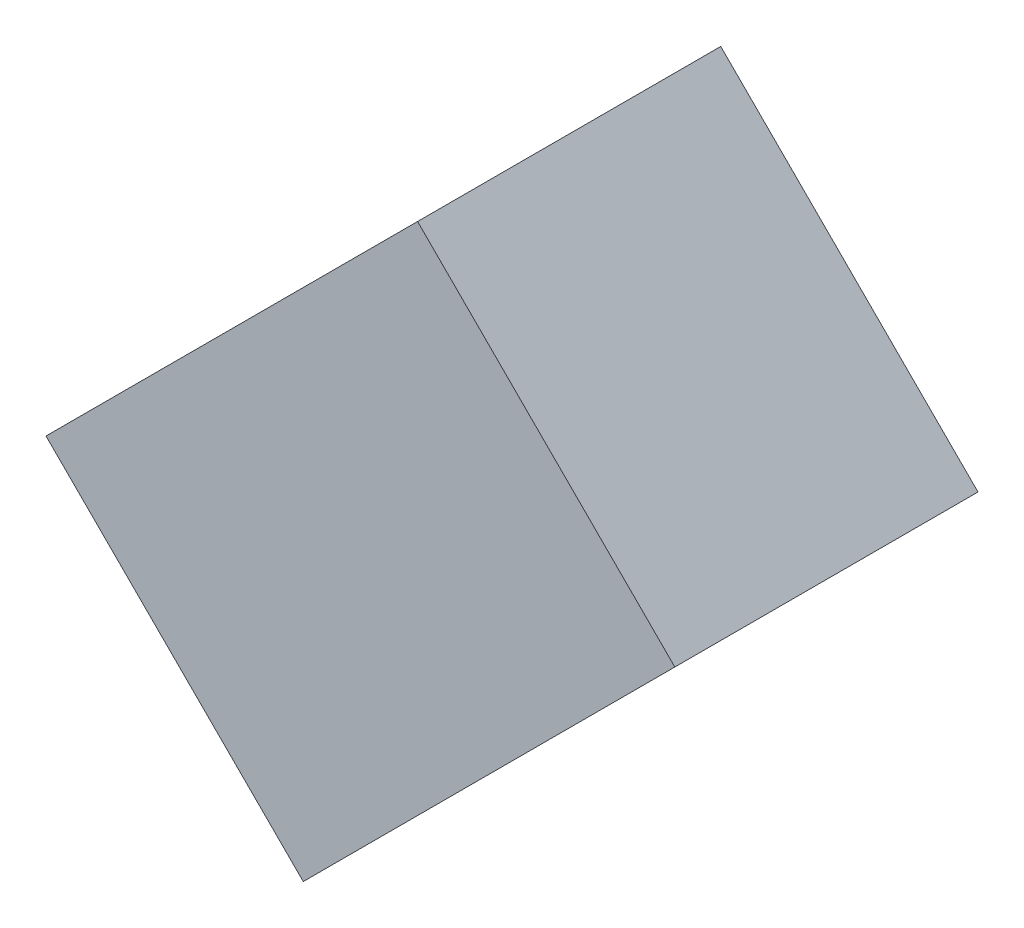
ISO-10303-21;
HEADER;
FILE_DESCRIPTION(('STEP AP214'),'2;1');
FILE_NAME('part.step','',(''),(''),'','','');
FILE_SCHEMA(('AUTOMOTIVE_DESIGN { 1 0 10303 214 1 1 1 1 }'));
ENDSEC;
DATA;
#1=APPLICATION_CONTEXT('core data for automotive mechanical design processes');
#2=APPLICATION_PROTOCOL_DEFINITION('international standard','automotive_design',2000,#1);
#3=PRODUCT_CONTEXT('',#1,'mechanical');
#4=PRODUCT('Part','Part','',(#3));
#5=PRODUCT_RELATED_PRODUCT_CATEGORY('part','',(#4));
#6=PRODUCT_DEFINITION_FORMATION('','',#4);
#7=PRODUCT_DEFINITION_CONTEXT('part definition',#1,'design');
#8=PRODUCT_DEFINITION('design','',#6,#7);
#9=PRODUCT_DEFINITION_SHAPE('','',#8);
#10=(LENGTH_UNIT() NAMED_UNIT(*) SI_UNIT(.MILLI.,.METRE.));
#11=(NAMED_UNIT(*) PLANE_ANGLE_UNIT() SI_UNIT($,.RADIAN.));
#12=(NAMED_UNIT(*) SI_UNIT($,.STERADIAN.) SOLID_ANGLE_UNIT());
#13=UNCERTAINTY_MEASURE_WITH_UNIT(LENGTH_MEASURE(1.E-05),#10,'distance_accuracy_value','');
#14=(GEOMETRIC_REPRESENTATION_CONTEXT(3) GLOBAL_UNCERTAINTY_ASSIGNED_CONTEXT((#13)) GLOBAL_UNIT_ASSIGNED_CONTEXT((#10,
#11,#12)) REPRESENTATION_CONTEXT('',''));
#15=CARTESIAN_POINT('',(0.,0.,0.));
#16=DIRECTION('',(0.,0.,1.));
#17=DIRECTION('',(1.,0.,0.));
#18=AXIS2_PLACEMENT_3D('',#15,#16,#17);
#19=CARTESIAN_POINT('',(-19.500015189612,-4.07757322966242,2.87531708400001));
#20=CARTESIAN_POINT('',(-19.500015189612,-4.07757322966242,1.97531583600001));
#21=CARTESIAN_POINT('',(-18.736341837612,-4.84124658166243,2.87531708400001));
#22=CARTESIAN_POINT('',(-18.736341837612,-4.84124658166243,1.97531583600001));
#23=(BOUNDED_SURFACE() B_SPLINE_SURFACE(1,1,((#19,#20),(#21,#22)),.UNSPECIFIED.,.F.,.F.,
.F.) B_SPLINE_SURFACE_WITH_KNOTS((2,2),(2,2),(-8.9999767635111E-05,0.000989997443986221),
(-0.000825001144,7.5000104E-05),
.UNSPECIFIED.) GEOMETRIC_REPRESENTATION_ITEM() RATIONAL_B_SPLINE_SURFACE(((1.,1.),(1.,1.))) REPRESENTATION_ITEM('') SURFACE());
#24=CARTESIAN_POINT('',(-18.799981283612,-4.77760713566243,2.05031594000001));
#25=CARTESIAN_POINT('',(-19.436375743612,-4.14121267566243,2.05031594000001));
#26=(BOUNDED_CURVE() B_SPLINE_CURVE(1,(#24,#25),.UNSPECIFIED.,.F.,
.F.) B_SPLINE_CURVE_WITH_KNOTS((2,2),(0.,0.000899997676351109),
.UNSPECIFIED.) CURVE() GEOMETRIC_REPRESENTATION_ITEM() RATIONAL_B_SPLINE_CURVE((1.,1.)) REPRESENTATION_ITEM(''));
#27=CARTESIAN_POINT('',(-18.799981283612,-4.77760713566243,2.05031594000001));
#28=VERTEX_POINT('',#27);
#29=CARTESIAN_POINT('',(-19.436375743612,-4.14121267566242,2.05031594000001));
#30=VERTEX_POINT('',#29);
#31=EDGE_CURVE('E64',#28,#30,#26,.T.);
#32=CARTESIAN_POINT('',(-19.436375743612,-4.14121267566242,2.05031594000001));
#33=CARTESIAN_POINT('',(-19.436375743612,-4.14121267566242,2.80031698000001));
#34=(BOUNDED_CURVE() B_SPLINE_CURVE(1,(#32,#33),.UNSPECIFIED.,.F.,
.F.) B_SPLINE_CURVE_WITH_KNOTS((2,2),(0.,0.00075000104),
.UNSPECIFIED.) CURVE() GEOMETRIC_REPRESENTATION_ITEM() RATIONAL_B_SPLINE_CURVE((1.,1.)) REPRESENTATION_ITEM(''));
#35=CARTESIAN_POINT('',(-19.436375743612,-4.14121267566242,2.80031698000001));
#36=VERTEX_POINT('',#35);
#37=EDGE_CURVE('E11',#30,#36,#34,.T.);
#38=CARTESIAN_POINT('',(-18.799981283612,-4.77760713566243,2.80031698000001));
#39=CARTESIAN_POINT('',(-19.436375743612,-4.14121267566243,2.80031698000001));
#40=(BOUNDED_CURVE() B_SPLINE_CURVE(1,(#38,#39),.UNSPECIFIED.,.F.,
.F.) B_SPLINE_CURVE_WITH_KNOTS((2,2),(0.,0.000899997676351109),
.UNSPECIFIED.) CURVE() GEOMETRIC_REPRESENTATION_ITEM() RATIONAL_B_SPLINE_CURVE((1.,1.)) REPRESENTATION_ITEM(''));
#41=CARTESIAN_POINT('',(-18.799981283612,-4.77760713566243,2.80031698000001));
#42=VERTEX_POINT('',#41);
#43=EDGE_CURVE('E62',#42,#36,#40,.T.);
#44=CARTESIAN_POINT('',(-18.799981283612,-4.77760713566243,2.05031594000001));
#45=CARTESIAN_POINT('',(-18.799981283612,-4.77760713566243,2.80031698000001));
#46=(BOUNDED_CURVE() B_SPLINE_CURVE(1,(#44,#45),.UNSPECIFIED.,.F.,
.F.) B_SPLINE_CURVE_WITH_KNOTS((2,2),(0.,0.00075000104),
.UNSPECIFIED.) CURVE() GEOMETRIC_REPRESENTATION_ITEM() RATIONAL_B_SPLINE_CURVE((1.,1.)) REPRESENTATION_ITEM(''));
#47=EDGE_CURVE('E23',#28,#42,#46,.T.);
#48=ORIENTED_EDGE('',*,*,#31,.T.);
#49=ORIENTED_EDGE('',*,*,#37,.T.);
#50=ORIENTED_EDGE('',*,*,#43,.F.);
#51=ORIENTED_EDGE('',*,*,#47,.F.);
#52=EDGE_LOOP('',(#48,#49,#50,#51));
#53=FACE_BOUND('',#52,.T.);
#54=ADVANCED_FACE('F17',(#53),#23,.T.);
#55=CARTESIAN_POINT('',(-20.447538313612,-5.15237524566242,2.87531708400001));
#56=CARTESIAN_POINT('',(-20.447538313612,-5.15237524566242,1.97531583600001));
#57=CARTESIAN_POINT('',(-19.344451873612,-4.04928880566242,2.87531708400001));
#58=CARTESIAN_POINT('',(-19.344451873612,-4.04928880566242,1.97531583600001));
#59=(BOUNDED_SURFACE() B_SPLINE_SURFACE(1,1,((#55,#56),(#57,#58)),.UNSPECIFIED.,.F.,.F.,
.F.) B_SPLINE_SURFACE_WITH_KNOTS((2,2),(2,2),(-0.000129999983659822,0.00142999982025804),
(-0.000825001144,7.5000104E-05),
.UNSPECIFIED.) GEOMETRIC_REPRESENTATION_ITEM() RATIONAL_B_SPLINE_SURFACE(((1.,1.),(1.,1.))) REPRESENTATION_ITEM('') SURFACE());
#60=CARTESIAN_POINT('',(-19.436375743612,-4.14121267566242,2.05031594000001));
#61=CARTESIAN_POINT('',(-20.355614443612,-5.06045137566242,2.05031594000001));
#62=(BOUNDED_CURVE() B_SPLINE_CURVE(1,(#60,#61),.UNSPECIFIED.,.F.,
.F.) B_SPLINE_CURVE_WITH_KNOTS((2,2),(0.,0.00129999983659822),
.UNSPECIFIED.) CURVE() GEOMETRIC_REPRESENTATION_ITEM() RATIONAL_B_SPLINE_CURVE((1.,1.)) REPRESENTATION_ITEM(''));
#63=CARTESIAN_POINT('',(-20.355614443612,-5.06045137566243,2.05031594000001));
#64=VERTEX_POINT('',#63);
#65=EDGE_CURVE('E114',#30,#64,#62,.T.);
#66=CARTESIAN_POINT('',(-20.355614443612,-5.06045137566243,2.05031594000001));
#67=CARTESIAN_POINT('',(-20.355614443612,-5.06045137566243,2.80031698000001));
#68=(BOUNDED_CURVE() B_SPLINE_CURVE(1,(#66,#67),.UNSPECIFIED.,.F.,
.F.) B_SPLINE_CURVE_WITH_KNOTS((2,2),(0.,0.00075000104),
.UNSPECIFIED.) CURVE() GEOMETRIC_REPRESENTATION_ITEM() RATIONAL_B_SPLINE_CURVE((1.,1.)) REPRESENTATION_ITEM(''));
#69=CARTESIAN_POINT('',(-20.355614443612,-5.06045137566243,2.80031698000001));
#70=VERTEX_POINT('',#69);
#71=EDGE_CURVE('E31',#64,#70,#68,.T.);
#72=CARTESIAN_POINT('',(-19.436375743612,-4.14121267566242,2.80031698000001));
#73=CARTESIAN_POINT('',(-20.355614443612,-5.06045137566242,2.80031698000001));
#74=(BOUNDED_CURVE() B_SPLINE_CURVE(1,(#72,#73),.UNSPECIFIED.,.F.,
.F.) B_SPLINE_CURVE_WITH_KNOTS((2,2),(0.,0.00129999983659822),
.UNSPECIFIED.) CURVE() GEOMETRIC_REPRESENTATION_ITEM() RATIONAL_B_SPLINE_CURVE((1.,1.)) REPRESENTATION_ITEM(''));
#75=EDGE_CURVE('E67',#36,#70,#74,.T.);
#76=ORIENTED_EDGE('',*,*,#65,.T.);
#77=ORIENTED_EDGE('',*,*,#71,.T.);
#78=ORIENTED_EDGE('',*,*,#75,.F.);
#79=ORIENTED_EDGE('',*,*,#37,.F.);
#80=EDGE_LOOP('',(#76,#77,#78,#79));
#81=FACE_BOUND('',#80,.T.);
#82=ADVANCED_FACE('F68',(#81),#59,.T.);
#83=CARTESIAN_POINT('',(-19.655580537612,-5.76048528166243,2.87531708400001));
#84=CARTESIAN_POINT('',(-19.655580537612,-5.76048528166243,1.97531583600001));
#85=CARTESIAN_POINT('',(-20.419253889612,-4.99681192966243,2.87531708400001));
#86=CARTESIAN_POINT('',(-20.419253889612,-4.99681192966243,1.97531583600001));
#87=(BOUNDED_SURFACE() B_SPLINE_SURFACE(1,1,((#83,#84),(#85,#86)),.UNSPECIFIED.,.F.,.F.,
.F.) B_SPLINE_SURFACE_WITH_KNOTS((2,2),(2,2),(-8.99997676351102E-05,0.000989997443986212),
(-0.000825001144,7.5000104E-05),
.UNSPECIFIED.) GEOMETRIC_REPRESENTATION_ITEM() RATIONAL_B_SPLINE_SURFACE(((1.,1.),(1.,1.))) REPRESENTATION_ITEM('') SURFACE());
#88=CARTESIAN_POINT('',(-20.355614443612,-5.06045137566243,2.05031594000001));
#89=CARTESIAN_POINT('',(-19.719219983612,-5.69684583566243,2.05031594000001));
#90=(BOUNDED_CURVE() B_SPLINE_CURVE(1,(#88,#89),.UNSPECIFIED.,.F.,
.F.) B_SPLINE_CURVE_WITH_KNOTS((2,2),(0.,0.000899997676351101),
.UNSPECIFIED.) CURVE() GEOMETRIC_REPRESENTATION_ITEM() RATIONAL_B_SPLINE_CURVE((1.,1.)) REPRESENTATION_ITEM(''));
#91=CARTESIAN_POINT('',(-19.719219983612,-5.69684583566243,2.05031594000001));
#92=VERTEX_POINT('',#91);
#93=EDGE_CURVE('E87',#64,#92,#90,.T.);
#94=CARTESIAN_POINT('',(-19.719219983612,-5.69684583566243,2.05031594000001));
#95=CARTESIAN_POINT('',(-19.719219983612,-5.69684583566243,2.80031698000001));
#96=(BOUNDED_CURVE() B_SPLINE_CURVE(1,(#94,#95),.UNSPECIFIED.,.F.,
.F.) B_SPLINE_CURVE_WITH_KNOTS((2,2),(0.,0.00075000104),
.UNSPECIFIED.) CURVE() GEOMETRIC_REPRESENTATION_ITEM() RATIONAL_B_SPLINE_CURVE((1.,1.)) REPRESENTATION_ITEM(''));
#97=CARTESIAN_POINT('',(-19.719219983612,-5.69684583566243,2.80031698000001));
#98=VERTEX_POINT('',#97);
#99=EDGE_CURVE('E97',#92,#98,#96,.T.);
#100=CARTESIAN_POINT('',(-20.355614443612,-5.06045137566243,2.80031698000001));
#101=CARTESIAN_POINT('',(-19.719219983612,-5.69684583566243,2.80031698000001));
#102=(BOUNDED_CURVE() B_SPLINE_CURVE(1,(#100,#101),.UNSPECIFIED.,.F.,
.F.) B_SPLINE_CURVE_WITH_KNOTS((2,2),(0.,0.000899997676351101),
.UNSPECIFIED.) CURVE() GEOMETRIC_REPRESENTATION_ITEM() RATIONAL_B_SPLINE_CURVE((1.,1.)) REPRESENTATION_ITEM(''));
#103=EDGE_CURVE('E72',#70,#98,#102,.T.);
#104=ORIENTED_EDGE('',*,*,#93,.T.);
#105=ORIENTED_EDGE('',*,*,#99,.T.);
#106=ORIENTED_EDGE('',*,*,#103,.F.);
#107=ORIENTED_EDGE('',*,*,#71,.F.);
#108=EDGE_LOOP('',(#104,#105,#106,#107));
#109=FACE_BOUND('',#108,.T.);
#110=ADVANCED_FACE('F216',(#109),#87,.T.);
#111=CARTESIAN_POINT('',(-18.708057413612,-4.68568326566243,2.87531708400001));
#112=CARTESIAN_POINT('',(-18.708057413612,-4.68568326566243,1.97531583600001));
#113=CARTESIAN_POINT('',(-19.811143853612,-5.78876970566243,2.87531708400001));
#114=CARTESIAN_POINT('',(-19.811143853612,-5.78876970566243,1.97531583600001));
#115=(BOUNDED_SURFACE() B_SPLINE_SURFACE(1,1,((#111,#112),(#113,#114)),.UNSPECIFIED.,.F.,.F.,
.F.) B_SPLINE_SURFACE_WITH_KNOTS((2,2),(2,2),(-0.000129999983659821,0.00142999982025804),
(-0.000825001144,7.5000104E-05),
.UNSPECIFIED.) GEOMETRIC_REPRESENTATION_ITEM() RATIONAL_B_SPLINE_SURFACE(((1.,1.),(1.,1.))) REPRESENTATION_ITEM('') SURFACE());
#116=CARTESIAN_POINT('',(-19.719219983612,-5.69684583566243,2.05031594000001));
#117=CARTESIAN_POINT('',(-18.799981283612,-4.77760713566243,2.05031594000001));
#118=(BOUNDED_CURVE() B_SPLINE_CURVE(1,(#116,#117),.UNSPECIFIED.,.F.,
.F.) B_SPLINE_CURVE_WITH_KNOTS((2,2),(0.,0.00129999983659821),
.UNSPECIFIED.) CURVE() GEOMETRIC_REPRESENTATION_ITEM() RATIONAL_B_SPLINE_CURVE((1.,1.)) REPRESENTATION_ITEM(''));
#119=EDGE_CURVE('E105',#92,#28,#118,.T.);
#120=CARTESIAN_POINT('',(-19.719219983612,-5.69684583566243,2.80031698000001));
#121=CARTESIAN_POINT('',(-18.799981283612,-4.77760713566243,2.80031698000001));
#122=(BOUNDED_CURVE() B_SPLINE_CURVE(1,(#120,#121),.UNSPECIFIED.,.F.,
.F.) B_SPLINE_CURVE_WITH_KNOTS((2,2),(0.,0.00129999983659821),
.UNSPECIFIED.) CURVE() GEOMETRIC_REPRESENTATION_ITEM() RATIONAL_B_SPLINE_CURVE((1.,1.)) REPRESENTATION_ITEM(''));
#123=EDGE_CURVE('E77',#98,#42,#122,.T.);
#124=ORIENTED_EDGE('',*,*,#119,.T.);
#125=ORIENTED_EDGE('',*,*,#47,.T.);
#126=ORIENTED_EDGE('',*,*,#123,.F.);
#127=ORIENTED_EDGE('',*,*,#99,.F.);
#128=EDGE_LOOP('',(#124,#125,#126,#127));
#129=FACE_BOUND('',#128,.T.);
#130=ADVANCED_FACE('F221',(#129),#115,.T.);
#131=CARTESIAN_POINT('',(-18.644417967612,-5.85240915166243,2.05031594000001));
#132=CARTESIAN_POINT('',(-18.644417967612,-3.98564935966242,2.05031594000001));
#133=CARTESIAN_POINT('',(-20.511177759612,-5.85240915166243,2.05031594000001));
#134=CARTESIAN_POINT('',(-20.511177759612,-3.98564935966242,2.05031594000001));
#135=(BOUNDED_SURFACE() B_SPLINE_SURFACE(1,1,((#131,#132),(#133,#134)),.UNSPECIFIED.,.F.,.F.,
.F.) B_SPLINE_SURFACE_WITH_KNOTS((2,2),(2,2),(-0.000155563316,0.001711196476),(-0.001074802016,
0.000791957776000011),
.UNSPECIFIED.) GEOMETRIC_REPRESENTATION_ITEM() RATIONAL_B_SPLINE_SURFACE(((1.,1.),(1.,1.))) REPRESENTATION_ITEM('') SURFACE());
#136=ORIENTED_EDGE('',*,*,#119,.F.);
#137=ORIENTED_EDGE('',*,*,#93,.F.);
#138=ORIENTED_EDGE('',*,*,#65,.F.);
#139=ORIENTED_EDGE('',*,*,#31,.F.);
#140=EDGE_LOOP('',(#136,#137,#138,#139));
#141=FACE_BOUND('',#140,.T.);
#142=ADVANCED_FACE('F19',(#141),#135,.T.);
#143=CARTESIAN_POINT('',(-20.511177759612,-5.85240915166243,2.80031698000001));
#144=CARTESIAN_POINT('',(-20.511177759612,-3.98564935966242,2.80031698000001));
#145=CARTESIAN_POINT('',(-18.644417967612,-5.85240915166243,2.80031698000001));
#146=CARTESIAN_POINT('',(-18.644417967612,-3.98564935966242,2.80031698000001));
#147=(BOUNDED_SURFACE() B_SPLINE_SURFACE(1,1,((#143,#144),(#145,#146)),.UNSPECIFIED.,.F.,.F.,
.F.) B_SPLINE_SURFACE_WITH_KNOTS((2,2),(2,2),(-0.000155563316,0.001711196476),(-0.001074802016,
0.000791957776000011),
.UNSPECIFIED.) GEOMETRIC_REPRESENTATION_ITEM() RATIONAL_B_SPLINE_SURFACE(((1.,1.),(1.,1.))) REPRESENTATION_ITEM('') SURFACE());
#148=ORIENTED_EDGE('',*,*,#43,.T.);
#149=ORIENTED_EDGE('',*,*,#75,.T.);
#150=ORIENTED_EDGE('',*,*,#103,.T.);
#151=ORIENTED_EDGE('',*,*,#123,.T.);
#152=EDGE_LOOP('',(#148,#149,#150,#151));
#153=FACE_BOUND('',#152,.T.);
#154=ADVANCED_FACE('F75',(#153),#147,.T.);
#155=CLOSED_SHELL('',(#54,#82,#110,#130,#142,#154));
#156=MANIFOLD_SOLID_BREP('B1',#155);
#157=ADVANCED_BREP_SHAPE_REPRESENTATION('',(#18,#156),#14);
#158=SHAPE_DEFINITION_REPRESENTATION(#9,#157);
ENDSEC;
END-ISO-10303-21;
